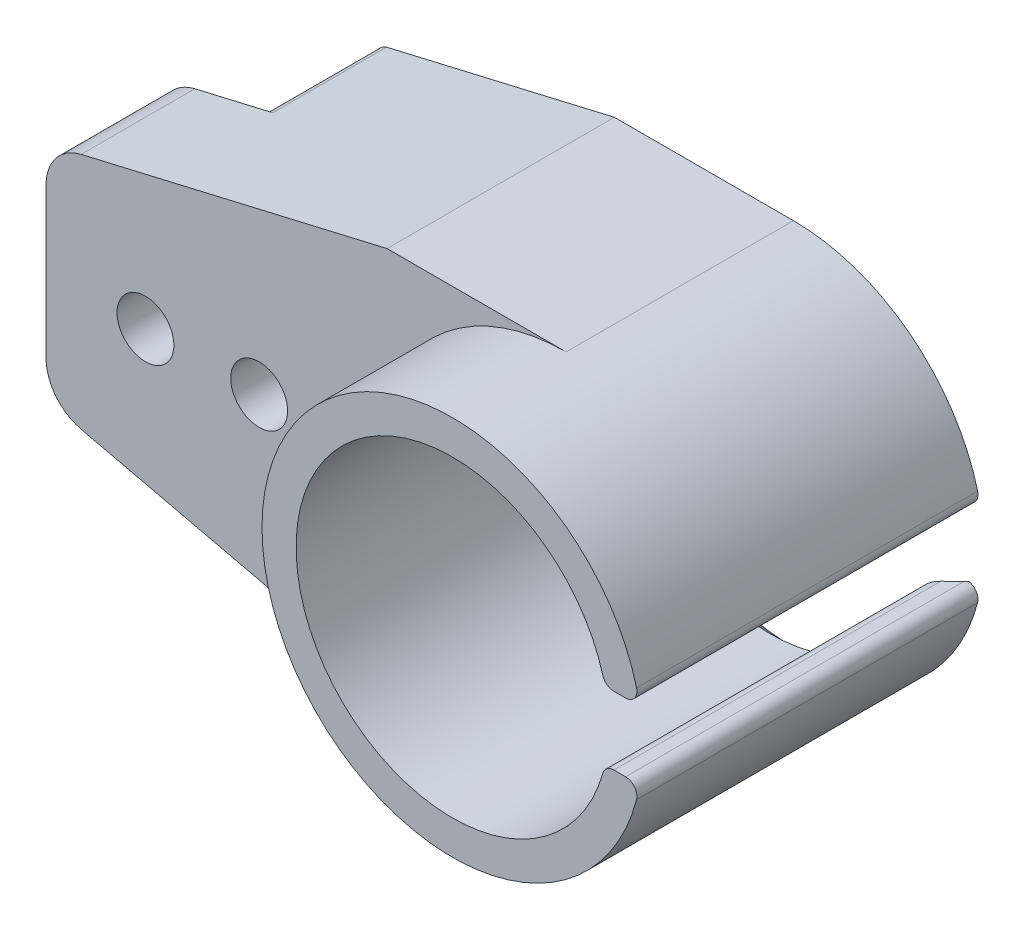
ISO-10303-21;
HEADER;
FILE_DESCRIPTION(('STEP AP214'),'2;1');
FILE_NAME('part.step','',(''),(''),'','','');
FILE_SCHEMA(('AUTOMOTIVE_DESIGN { 1 0 10303 214 1 1 1 1 }'));
ENDSEC;
DATA;
#1=APPLICATION_CONTEXT('core data for automotive mechanical design processes');
#2=APPLICATION_PROTOCOL_DEFINITION('international standard','automotive_design',2000,#1);
#3=PRODUCT_CONTEXT('',#1,'mechanical');
#4=PRODUCT('Part','Part','',(#3));
#5=PRODUCT_RELATED_PRODUCT_CATEGORY('part','',(#4));
#6=PRODUCT_DEFINITION_FORMATION('','',#4);
#7=PRODUCT_DEFINITION_CONTEXT('part definition',#1,'design');
#8=PRODUCT_DEFINITION('design','',#6,#7);
#9=PRODUCT_DEFINITION_SHAPE('','',#8);
#10=(LENGTH_UNIT() NAMED_UNIT(*) SI_UNIT(.MILLI.,.METRE.));
#11=(NAMED_UNIT(*) PLANE_ANGLE_UNIT() SI_UNIT($,.RADIAN.));
#12=(NAMED_UNIT(*) SI_UNIT($,.STERADIAN.) SOLID_ANGLE_UNIT());
#13=UNCERTAINTY_MEASURE_WITH_UNIT(LENGTH_MEASURE(1.E-05),#10,'distance_accuracy_value','');
#14=(GEOMETRIC_REPRESENTATION_CONTEXT(3) GLOBAL_UNCERTAINTY_ASSIGNED_CONTEXT((#13)) GLOBAL_UNIT_ASSIGNED_CONTEXT((#10,
#11,#12)) REPRESENTATION_CONTEXT('',''));
#15=CARTESIAN_POINT('',(0.,0.,0.));
#16=DIRECTION('',(0.,0.,1.));
#17=DIRECTION('',(1.,0.,0.));
#18=AXIS2_PLACEMENT_3D('',#15,#16,#17);
#19=CARTESIAN_POINT('',(-37.,0.,30.));
#20=DIRECTION('',(0.,0.,-1.));
#21=DIRECTION('',(-1.,0.,0.));
#22=AXIS2_PLACEMENT_3D('',#19,#20,#21);
#23=CYLINDRICAL_SURFACE('',#22,2.5);
#24=CARTESIAN_POINT('',(-37.,0.,10.));
#25=DIRECTION('',(0.,0.,-1.));
#26=DIRECTION('',(-1.,0.,0.));
#27=AXIS2_PLACEMENT_3D('',#24,#25,#26);
#28=CIRCLE('',#27,2.5);
#29=CARTESIAN_POINT('',(-39.5,0.,10.));
#30=VERTEX_POINT('',#29);
#31=EDGE_CURVE('E228',#30,#30,#28,.T.);
#32=ORIENTED_EDGE('',*,*,#31,.T.);
#33=EDGE_LOOP('',(#32));
#34=FACE_BOUND('',#33,.T.);
#35=CARTESIAN_POINT('',(-37.,0.,20.));
#36=DIRECTION('',(0.,0.,1.));
#37=DIRECTION('',(1.,0.,0.));
#38=AXIS2_PLACEMENT_3D('',#35,#36,#37);
#39=CIRCLE('',#38,2.5);
#40=CARTESIAN_POINT('',(-34.5,0.,20.));
#41=VERTEX_POINT('',#40);
#42=EDGE_CURVE('E496',#41,#41,#39,.T.);
#43=ORIENTED_EDGE('',*,*,#42,.T.);
#44=EDGE_LOOP('',(#43));
#45=FACE_BOUND('',#44,.T.);
#46=ADVANCED_FACE('F39',(#34,#45),#23,.F.);
#47=CARTESIAN_POINT('',(-27.,0.,30.));
#48=DIRECTION('',(0.,0.,-1.));
#49=DIRECTION('',(-1.,0.,0.));
#50=AXIS2_PLACEMENT_3D('',#47,#48,#49);
#51=CYLINDRICAL_SURFACE('',#50,2.5);
#52=CARTESIAN_POINT('',(-27.,0.,10.));
#53=DIRECTION('',(0.,0.,-1.));
#54=DIRECTION('',(-1.,0.,0.));
#55=AXIS2_PLACEMENT_3D('',#52,#53,#54);
#56=CIRCLE('',#55,2.5);
#57=CARTESIAN_POINT('',(-29.5,0.,10.));
#58=VERTEX_POINT('',#57);
#59=EDGE_CURVE('E382',#58,#58,#56,.T.);
#60=ORIENTED_EDGE('',*,*,#59,.T.);
#61=EDGE_LOOP('',(#60));
#62=FACE_BOUND('',#61,.T.);
#63=CARTESIAN_POINT('',(-27.,0.,20.));
#64=DIRECTION('',(0.,0.,1.));
#65=DIRECTION('',(1.,0.,0.));
#66=AXIS2_PLACEMENT_3D('',#63,#64,#65);
#67=CIRCLE('',#66,2.5);
#68=CARTESIAN_POINT('',(-24.5,0.,20.));
#69=VERTEX_POINT('',#68);
#70=EDGE_CURVE('E493',#69,#69,#67,.T.);
#71=ORIENTED_EDGE('',*,*,#70,.T.);
#72=EDGE_LOOP('',(#71));
#73=FACE_BOUND('',#72,.T.);
#74=ADVANCED_FACE('F276',(#62,#73),#51,.F.);
#75=CARTESIAN_POINT('',(-45.75,16.75,30.));
#76=DIRECTION('',(0.,-1.,0.));
#77=DIRECTION('',(0.,0.,-1.));
#78=AXIS2_PLACEMENT_3D('',#75,#76,#77);
#79=PLANE('',#78);
#80=DIRECTION('',(-1.,0.,0.));
#81=VECTOR('',#80,1.);
#82=CARTESIAN_POINT('',(-45.75,16.75,0.));
#83=LINE('',#82,#81);
#84=CARTESIAN_POINT('',(0.,16.75,0.));
#85=VERTEX_POINT('',#84);
#86=CARTESIAN_POINT('',(-15.75,16.75,0.));
#87=VERTEX_POINT('',#86);
#88=EDGE_CURVE('E201',#85,#87,#83,.T.);
#89=ORIENTED_EDGE('',*,*,#88,.T.);
#90=DIRECTION('',(0.,0.,1.));
#91=VECTOR('',#90,1.);
#92=CARTESIAN_POINT('',(-15.75,16.75,0.));
#93=LINE('',#92,#91);
#94=CARTESIAN_POINT('',(-15.75,16.75,20.));
#95=VERTEX_POINT('',#94);
#96=EDGE_CURVE('E206',#87,#95,#93,.T.);
#97=ORIENTED_EDGE('',*,*,#96,.T.);
#98=DIRECTION('',(-1.,0.,0.));
#99=VECTOR('',#98,1.);
#100=CARTESIAN_POINT('',(0.,16.75,20.));
#101=LINE('',#100,#99);
#102=CARTESIAN_POINT('',(0.,16.75,20.));
#103=VERTEX_POINT('',#102);
#104=EDGE_CURVE('E481',#103,#95,#101,.T.);
#105=ORIENTED_EDGE('',*,*,#104,.F.);
#106=DIRECTION('',(0.,0.,-1.));
#107=VECTOR('',#106,1.);
#108=CARTESIAN_POINT('',(0.,16.75,30.));
#109=LINE('',#108,#107);
#110=EDGE_CURVE('E221',#103,#85,#109,.T.);
#111=ORIENTED_EDGE('',*,*,#110,.T.);
#112=EDGE_LOOP('',(#89,#97,#105,#111));
#113=FACE_BOUND('',#112,.T.);
#114=ADVANCED_FACE('F219',(#113),#79,.F.);
#115=CARTESIAN_POINT('',(-45.75,-16.75,30.));
#116=DIRECTION('',(1.,0.,0.));
#117=DIRECTION('',(0.,0.,-1.));
#118=AXIS2_PLACEMENT_3D('',#115,#116,#117);
#119=PLANE('',#118);
#120=DIRECTION('',(0.,-1.,0.));
#121=VECTOR('',#120,1.);
#122=CARTESIAN_POINT('',(-45.75,16.75,20.));
#123=LINE('',#122,#121);
#124=CARTESIAN_POINT('',(-45.75,6.57588751980016,20.));
#125=VERTEX_POINT('',#124);
#126=CARTESIAN_POINT('',(-45.75,-6.57588751980016,20.));
#127=VERTEX_POINT('',#126);
#128=EDGE_CURVE('E484',#125,#127,#123,.T.);
#129=ORIENTED_EDGE('',*,*,#128,.F.);
#130=DIRECTION('',(0.,0.,1.));
#131=VECTOR('',#130,1.);
#132=CARTESIAN_POINT('',(-45.75,6.57588751980016,30.));
#133=LINE('',#132,#131);
#134=CARTESIAN_POINT('',(-45.75,6.57588751980016,10.));
#135=VERTEX_POINT('',#134);
#136=EDGE_CURVE('E60',#125,#135,#133,.F.);
#137=ORIENTED_EDGE('',*,*,#136,.T.);
#138=DIRECTION('',(0.,1.,0.));
#139=VECTOR('',#138,1.);
#140=CARTESIAN_POINT('',(-45.75,-10.1,10.));
#141=LINE('',#140,#139);
#142=CARTESIAN_POINT('',(-45.75,-6.57588751980017,10.));
#143=VERTEX_POINT('',#142);
#144=EDGE_CURVE('E500',#143,#135,#141,.T.);
#145=ORIENTED_EDGE('',*,*,#144,.F.);
#146=DIRECTION('',(0.,0.,1.));
#147=VECTOR('',#146,1.);
#148=CARTESIAN_POINT('',(-45.75,-6.57588751980017,30.));
#149=LINE('',#148,#147);
#150=EDGE_CURVE('E355',#143,#127,#149,.T.);
#151=ORIENTED_EDGE('',*,*,#150,.T.);
#152=EDGE_LOOP('',(#129,#137,#145,#151));
#153=FACE_BOUND('',#152,.T.);
#154=ADVANCED_FACE('F559',(#153),#119,.F.);
#155=CARTESIAN_POINT('',(0.,-16.75,30.));
#156=DIRECTION('',(0.,1.,0.));
#157=DIRECTION('',(0.,0.,1.));
#158=AXIS2_PLACEMENT_3D('',#155,#156,#157);
#159=PLANE('',#158);
#160=DIRECTION('',(1.,0.,0.));
#161=VECTOR('',#160,1.);
#162=CARTESIAN_POINT('',(-45.75,-16.75,20.));
#163=LINE('',#162,#161);
#164=CARTESIAN_POINT('',(-15.75,-16.75,20.));
#165=VERTEX_POINT('',#164);
#166=CARTESIAN_POINT('',(0.,-16.75,20.));
#167=VERTEX_POINT('',#166);
#168=EDGE_CURVE('E491',#165,#167,#163,.T.);
#169=ORIENTED_EDGE('',*,*,#168,.F.);
#170=DIRECTION('',(0.,0.,1.));
#171=VECTOR('',#170,1.);
#172=CARTESIAN_POINT('',(-15.75,-16.75,0.));
#173=LINE('',#172,#171);
#174=CARTESIAN_POINT('',(-15.75,-16.75,0.));
#175=VERTEX_POINT('',#174);
#176=EDGE_CURVE('E477',#175,#165,#173,.T.);
#177=ORIENTED_EDGE('',*,*,#176,.F.);
#178=DIRECTION('',(1.,0.,0.));
#179=VECTOR('',#178,1.);
#180=CARTESIAN_POINT('',(0.,-16.75,0.));
#181=LINE('',#180,#179);
#182=CARTESIAN_POINT('',(0.,-16.75,0.));
#183=VERTEX_POINT('',#182);
#184=EDGE_CURVE('E223',#175,#183,#181,.T.);
#185=ORIENTED_EDGE('',*,*,#184,.T.);
#186=DIRECTION('',(0.,0.,-1.));
#187=VECTOR('',#186,1.);
#188=CARTESIAN_POINT('',(0.,-16.75,30.));
#189=LINE('',#188,#187);
#190=EDGE_CURVE('E235',#167,#183,#189,.T.);
#191=ORIENTED_EDGE('',*,*,#190,.F.);
#192=EDGE_LOOP('',(#169,#177,#185,#191));
#193=FACE_BOUND('',#192,.T.);
#194=ADVANCED_FACE('F289',(#193),#159,.F.);
#195=CARTESIAN_POINT('',(0.,0.,30.));
#196=DIRECTION('',(0.,0.,1.));
#197=DIRECTION('',(1.,0.,0.));
#198=AXIS2_PLACEMENT_3D('',#195,#196,#197);
#199=PLANE('',#198);
#200=CARTESIAN_POINT('',(15.2335977365821,4.,30.));
#201=DIRECTION('',(0.,0.,1.));
#202=DIRECTION('',(1.,0.,0.));
#203=AXIS2_PLACEMENT_3D('',#200,#201,#202);
#204=CIRCLE('',#203,1.);
#205=CARTESIAN_POINT('',(15.2335977365821,3.,30.));
#206=VERTEX_POINT('',#205);
#207=CARTESIAN_POINT('',(16.2008102912858,4.25396825396825,30.));
#208=VERTEX_POINT('',#207);
#209=EDGE_CURVE('E400',#206,#208,#204,.T.);
#210=ORIENTED_EDGE('',*,*,#209,.T.);
#211=CARTESIAN_POINT('',(0.,0.,30.));
#212=DIRECTION('',(0.,0.,1.));
#213=DIRECTION('',(-1.,0.,0.));
#214=AXIS2_PLACEMENT_3D('',#211,#212,#213);
#215=CIRCLE('',#214,16.75);
#216=CARTESIAN_POINT('',(16.2008102912858,-4.25396825396825,30.));
#217=VERTEX_POINT('',#216);
#218=EDGE_CURVE('E441',#208,#217,#215,.T.);
#219=ORIENTED_EDGE('',*,*,#218,.T.);
#220=CARTESIAN_POINT('',(15.2335977365821,-4.,30.));
#221=DIRECTION('',(0.,0.,1.));
#222=DIRECTION('',(1.,0.,0.));
#223=AXIS2_PLACEMENT_3D('',#220,#221,#222);
#224=CIRCLE('',#223,1.);
#225=CARTESIAN_POINT('',(15.2335977365821,-3.,30.));
#226=VERTEX_POINT('',#225);
#227=EDGE_CURVE('E398',#217,#226,#224,.T.);
#228=ORIENTED_EDGE('',*,*,#227,.T.);
#229=DIRECTION('',(-1.,0.,0.));
#230=VECTOR('',#229,1.);
#231=CARTESIAN_POINT('',(16.479153497677,-3.,30.));
#232=LINE('',#231,#230);
#233=CARTESIAN_POINT('',(14.1972708645007,-3.,30.));
#234=VERTEX_POINT('',#233);
#235=EDGE_CURVE('E238',#226,#234,#232,.T.);
#236=ORIENTED_EDGE('',*,*,#235,.T.);
#237=CARTESIAN_POINT('',(14.1972708645007,-4.,30.));
#238=DIRECTION('',(0.,0.,1.));
#239=DIRECTION('',(1.,0.,0.));
#240=AXIS2_PLACEMENT_3D('',#237,#238,#239);
#241=CIRCLE('',#240,1.);
#242=CARTESIAN_POINT('',(13.2347440262295,-3.72881355932203,30.));
#243=VERTEX_POINT('',#242);
#244=EDGE_CURVE('E403',#234,#243,#241,.T.);
#245=ORIENTED_EDGE('',*,*,#244,.T.);
#246=CARTESIAN_POINT('',(0.,0.,30.));
#247=DIRECTION('',(0.,0.,-1.));
#248=DIRECTION('',(1.,0.,0.));
#249=AXIS2_PLACEMENT_3D('',#246,#247,#248);
#250=CIRCLE('',#249,13.75);
#251=CARTESIAN_POINT('',(13.2347440262295,3.72881355932203,30.));
#252=VERTEX_POINT('',#251);
#253=EDGE_CURVE('E234',#243,#252,#250,.T.);
#254=ORIENTED_EDGE('',*,*,#253,.T.);
#255=CARTESIAN_POINT('',(14.1972708645007,4.,30.));
#256=DIRECTION('',(0.,0.,1.));
#257=DIRECTION('',(1.,0.,0.));
#258=AXIS2_PLACEMENT_3D('',#255,#256,#257);
#259=CIRCLE('',#258,1.);
#260=CARTESIAN_POINT('',(14.1972708645007,3.,30.));
#261=VERTEX_POINT('',#260);
#262=EDGE_CURVE('E405',#252,#261,#259,.T.);
#263=ORIENTED_EDGE('',*,*,#262,.T.);
#264=DIRECTION('',(1.,0.,0.));
#265=VECTOR('',#264,1.);
#266=CARTESIAN_POINT('',(13.4187369003196,3.,30.));
#267=LINE('',#266,#265);
#268=EDGE_CURVE('E444',#261,#206,#267,.T.);
#269=ORIENTED_EDGE('',*,*,#268,.T.);
#270=EDGE_LOOP('',(#210,#219,#228,#236,#245,#254,#263,#269));
#271=FACE_BOUND('',#270,.T.);
#272=ADVANCED_FACE('F272',(#271),#199,.T.);
#273=CARTESIAN_POINT('',(0.,0.,0.));
#274=DIRECTION('',(0.,0.,1.));
#275=DIRECTION('',(1.,0.,0.));
#276=AXIS2_PLACEMENT_3D('',#273,#274,#275);
#277=PLANE('',#276);
#278=DIRECTION('',(1.,0.,0.));
#279=VECTOR('',#278,1.);
#280=CARTESIAN_POINT('',(-45.75,10.1,0.));
#281=LINE('',#280,#279);
#282=CARTESIAN_POINT('',(-35.5634509140716,10.1,0.));
#283=VERTEX_POINT('',#282);
#284=CARTESIAN_POINT('',(-27.,10.1,0.));
#285=VERTEX_POINT('',#284);
#286=EDGE_CURVE('E499',#283,#285,#281,.T.);
#287=ORIENTED_EDGE('',*,*,#286,.F.);
#288=CARTESIAN_POINT('',(-35.5634509140716,11.1,0.));
#289=DIRECTION('',(0.,0.,1.));
#290=DIRECTION('',(1.,0.,0.));
#291=AXIS2_PLACEMENT_3D('',#288,#289,#290);
#292=CIRCLE('',#291,1.);
#293=CARTESIAN_POINT('',(-35.790680529678,12.0738412097418,0.));
#294=VERTEX_POINT('',#293);
#295=EDGE_CURVE('E202',#283,#294,#292,.F.);
#296=ORIENTED_EDGE('',*,*,#295,.T.);
#297=DIRECTION('',(0.973841209741793,0.227229615606419,0.));
#298=VECTOR('',#297,1.);
#299=CARTESIAN_POINT('',(-15.75,16.75,0.));
#300=LINE('',#299,#298);
#301=EDGE_CURVE('E195',#294,#87,#300,.T.);
#302=ORIENTED_EDGE('',*,*,#301,.T.);
#303=ORIENTED_EDGE('',*,*,#88,.F.);
#304=CARTESIAN_POINT('',(0.,0.,0.));
#305=DIRECTION('',(0.,0.,1.));
#306=DIRECTION('',(1.,0.,0.));
#307=AXIS2_PLACEMENT_3D('',#304,#305,#306);
#308=CIRCLE('',#307,16.75);
#309=CARTESIAN_POINT('',(16.2008102912858,4.25396825396825,0.));
#310=VERTEX_POINT('',#309);
#311=EDGE_CURVE('E224',#310,#85,#308,.T.);
#312=ORIENTED_EDGE('',*,*,#311,.F.);
#313=CARTESIAN_POINT('',(15.2335977365821,4.,0.));
#314=DIRECTION('',(0.,0.,1.));
#315=DIRECTION('',(1.,0.,0.));
#316=AXIS2_PLACEMENT_3D('',#313,#314,#315);
#317=CIRCLE('',#316,1.);
#318=CARTESIAN_POINT('',(15.4567328218829,3.02521246740236,0.));
#319=VERTEX_POINT('',#318);
#320=EDGE_CURVE('E411',#310,#319,#317,.F.);
#321=ORIENTED_EDGE('',*,*,#320,.T.);
#322=CARTESIAN_POINT('',(0.,0.,0.));
#323=DIRECTION('',(0.,0.,1.));
#324=DIRECTION('',(1.,0.,0.));
#325=AXIS2_PLACEMENT_3D('',#322,#323,#324);
#326=CIRCLE('',#325,15.75);
#327=CARTESIAN_POINT('',(15.4567328218829,-3.02521246740236,0.));
#328=VERTEX_POINT('',#327);
#329=EDGE_CURVE('E252',#319,#328,#326,.T.);
#330=ORIENTED_EDGE('',*,*,#329,.T.);
#331=CARTESIAN_POINT('',(15.2335977365821,-4.,0.));
#332=DIRECTION('',(0.,0.,1.));
#333=DIRECTION('',(1.,0.,0.));
#334=AXIS2_PLACEMENT_3D('',#331,#332,#333);
#335=CIRCLE('',#334,1.);
#336=CARTESIAN_POINT('',(16.2008102912858,-4.25396825396825,0.));
#337=VERTEX_POINT('',#336);
#338=EDGE_CURVE('E409',#328,#337,#335,.F.);
#339=ORIENTED_EDGE('',*,*,#338,.T.);
#340=CARTESIAN_POINT('',(0.,0.,0.));
#341=DIRECTION('',(0.,0.,1.));
#342=DIRECTION('',(-1.,0.,0.));
#343=AXIS2_PLACEMENT_3D('',#340,#341,#342);
#344=CIRCLE('',#343,16.75);
#345=EDGE_CURVE('E226',#183,#337,#344,.T.);
#346=ORIENTED_EDGE('',*,*,#345,.F.);
#347=ORIENTED_EDGE('',*,*,#184,.F.);
#348=DIRECTION('',(-0.973841209741793,0.227229615606419,0.));
#349=VECTOR('',#348,1.);
#350=CARTESIAN_POINT('',(-15.75,-16.75,0.));
#351=LINE('',#350,#349);
#352=CARTESIAN_POINT('',(-35.790680529678,-12.0738412097418,0.));
#353=VERTEX_POINT('',#352);
#354=EDGE_CURVE('E471',#175,#353,#351,.T.);
#355=ORIENTED_EDGE('',*,*,#354,.T.);
#356=CARTESIAN_POINT('',(-35.5634509140716,-11.1,0.));
#357=DIRECTION('',(0.,0.,1.));
#358=DIRECTION('',(1.,0.,0.));
#359=AXIS2_PLACEMENT_3D('',#356,#357,#358);
#360=CIRCLE('',#359,1.);
#361=CARTESIAN_POINT('',(-35.5634509140716,-10.1,0.));
#362=VERTEX_POINT('',#361);
#363=EDGE_CURVE('E376',#353,#362,#360,.F.);
#364=ORIENTED_EDGE('',*,*,#363,.T.);
#365=DIRECTION('',(-1.,0.,0.));
#366=VECTOR('',#365,1.);
#367=CARTESIAN_POINT('',(-27.,-10.1,0.));
#368=LINE('',#367,#366);
#369=CARTESIAN_POINT('',(-27.,-10.1,0.));
#370=VERTEX_POINT('',#369);
#371=EDGE_CURVE('E503',#370,#362,#368,.T.);
#372=ORIENTED_EDGE('',*,*,#371,.F.);
#373=CARTESIAN_POINT('',(-27.,0.,0.));
#374=DIRECTION('',(0.,0.,-1.));
#375=DIRECTION('',(-1.,0.,0.));
#376=AXIS2_PLACEMENT_3D('',#373,#374,#375);
#377=CIRCLE('',#376,10.1);
#378=EDGE_CURVE('E513',#285,#370,#377,.T.);
#379=ORIENTED_EDGE('',*,*,#378,.F.);
#380=EDGE_LOOP('',(#287,#296,#302,#303,#312,#321,#330,#339,#346,#347,#355,#364,#372,#379));
#381=FACE_BOUND('',#380,.T.);
#382=ADVANCED_FACE('F198',(#381),#277,.F.);
#383=CARTESIAN_POINT('',(0.,0.,30.));
#384=DIRECTION('',(0.,0.,-1.));
#385=DIRECTION('',(-1.,0.,0.));
#386=AXIS2_PLACEMENT_3D('',#383,#384,#385);
#387=CYLINDRICAL_SURFACE('',#386,13.75);
#388=ORIENTED_EDGE('',*,*,#253,.F.);
#389=DIRECTION('',(0.,0.,-1.));
#390=VECTOR('',#389,1.);
#391=CARTESIAN_POINT('',(13.2347440262294,-3.72881355932203,30.));
#392=LINE('',#391,#390);
#393=CARTESIAN_POINT('',(13.2347440262295,-3.72881355932203,2.));
#394=VERTEX_POINT('',#393);
#395=EDGE_CURVE('E381',#243,#394,#392,.T.);
#396=ORIENTED_EDGE('',*,*,#395,.T.);
#397=CARTESIAN_POINT('',(0.,0.,2.));
#398=DIRECTION('',(0.,0.,1.));
#399=DIRECTION('',(1.,0.,0.));
#400=AXIS2_PLACEMENT_3D('',#397,#398,#399);
#401=CIRCLE('',#400,13.75);
#402=CARTESIAN_POINT('',(13.2347440262295,3.72881355932203,2.));
#403=VERTEX_POINT('',#402);
#404=EDGE_CURVE('E240',#394,#403,#401,.F.);
#405=ORIENTED_EDGE('',*,*,#404,.T.);
#406=DIRECTION('',(0.,0.,-1.));
#407=VECTOR('',#406,1.);
#408=CARTESIAN_POINT('',(13.2347440262294,3.72881355932203,30.));
#409=LINE('',#408,#407);
#410=EDGE_CURVE('E388',#403,#252,#409,.F.);
#411=ORIENTED_EDGE('',*,*,#410,.T.);
#412=EDGE_LOOP('',(#388,#396,#405,#411));
#413=FACE_BOUND('',#412,.T.);
#414=ADVANCED_FACE('F264',(#413),#387,.F.);
#415=CARTESIAN_POINT('',(13.4187369003196,3.,30.));
#416=DIRECTION('',(0.,1.,0.));
#417=DIRECTION('',(0.,0.,1.));
#418=AXIS2_PLACEMENT_3D('',#415,#416,#417);
#419=PLANE('',#418);
#420=CARTESIAN_POINT('',(13.4187369003196,3.,2.));
#421=CARTESIAN_POINT('',(13.5892420785567,3.,1.83360189063175));
#422=CARTESIAN_POINT('',(13.7596725050172,3.,1.6671272100676));
#423=CARTESIAN_POINT('',(14.1003977059202,3.,1.334039267167));
#424=CARTESIAN_POINT('',(14.2706924804361,3.,1.1674260049056));
#425=CARTESIAN_POINT('',(14.6111603962887,3.,0.834075295950689));
#426=CARTESIAN_POINT('',(14.7813335376378,3.,0.667337849269743));
#427=CARTESIAN_POINT('',(15.1215696396513,3.,0.333750392598995));
#428=CARTESIAN_POINT('',(15.2916326002562,3.,0.166900382548354));
#429=CARTESIAN_POINT('',(15.4616460960662,3.,0.));
#430=B_SPLINE_CURVE_WITH_KNOTS('',3,(#420,#421,#422,#423,#424,#425,#426,#427,#428,#429),
.UNSPECIFIED.,.F.,.F.,(4,2,2,2,4),(0.,0.714732851002708,1.42946531515944,2.14419770694695,
2.85893048534193),.UNSPECIFIED.);
#431=CARTESIAN_POINT('',(14.1972708645007,3.,1.23922813906855));
#432=VERTEX_POINT('',#431);
#433=CARTESIAN_POINT('',(15.2335977365821,3.,0.223812444775767));
#434=VERTEX_POINT('',#433);
#435=EDGE_CURVE('E243',#432,#434,#430,.T.);
#436=ORIENTED_EDGE('',*,*,#435,.T.);
#437=DIRECTION('',(0.,0.,-1.));
#438=VECTOR('',#437,1.);
#439=CARTESIAN_POINT('',(15.2335977365821,3.,30.));
#440=LINE('',#439,#438);
#441=EDGE_CURVE('E390',#434,#206,#440,.F.);
#442=ORIENTED_EDGE('',*,*,#441,.T.);
#443=ORIENTED_EDGE('',*,*,#268,.F.);
#444=DIRECTION('',(0.,0.,-1.));
#445=VECTOR('',#444,1.);
#446=CARTESIAN_POINT('',(14.1972708645007,3.,30.));
#447=LINE('',#446,#445);
#448=EDGE_CURVE('E392',#261,#432,#447,.T.);
#449=ORIENTED_EDGE('',*,*,#448,.T.);
#450=EDGE_LOOP('',(#436,#442,#443,#449));
#451=FACE_BOUND('',#450,.T.);
#452=ADVANCED_FACE('F259',(#451),#419,.F.);
#453=CARTESIAN_POINT('',(0.,0.,30.));
#454=DIRECTION('',(0.,0.,-1.));
#455=DIRECTION('',(-1.,0.,0.));
#456=AXIS2_PLACEMENT_3D('',#453,#454,#455);
#457=CYLINDRICAL_SURFACE('',#456,16.75);
#458=ORIENTED_EDGE('',*,*,#345,.T.);
#459=DIRECTION('',(0.,0.,-1.));
#460=VECTOR('',#459,1.);
#461=CARTESIAN_POINT('',(16.2008102912858,-4.25396825396825,30.));
#462=LINE('',#461,#460);
#463=EDGE_CURVE('E407',#337,#217,#462,.F.);
#464=ORIENTED_EDGE('',*,*,#463,.T.);
#465=ORIENTED_EDGE('',*,*,#218,.F.);
#466=DIRECTION('',(0.,0.,-1.));
#467=VECTOR('',#466,1.);
#468=CARTESIAN_POINT('',(16.2008102912858,4.25396825396825,30.));
#469=LINE('',#468,#467);
#470=EDGE_CURVE('E395',#208,#310,#469,.T.);
#471=ORIENTED_EDGE('',*,*,#470,.T.);
#472=ORIENTED_EDGE('',*,*,#311,.T.);
#473=ORIENTED_EDGE('',*,*,#110,.F.);
#474=CARTESIAN_POINT('',(0.,0.,20.));
#475=DIRECTION('',(0.,0.,-1.));
#476=DIRECTION('',(1.,0.,0.));
#477=AXIS2_PLACEMENT_3D('',#474,#475,#476);
#478=CIRCLE('',#477,16.75);
#479=EDGE_CURVE('E479',#167,#103,#478,.T.);
#480=ORIENTED_EDGE('',*,*,#479,.F.);
#481=ORIENTED_EDGE('',*,*,#190,.T.);
#482=EDGE_LOOP('',(#458,#464,#465,#471,#472,#473,#480,#481));
#483=FACE_BOUND('',#482,.T.);
#484=ADVANCED_FACE('F263',(#483),#457,.T.);
#485=CARTESIAN_POINT('',(16.479153497677,-3.,30.));
#486=DIRECTION('',(0.,-1.,0.));
#487=DIRECTION('',(0.,0.,-1.));
#488=AXIS2_PLACEMENT_3D('',#485,#486,#487);
#489=PLANE('',#488);
#490=ORIENTED_EDGE('',*,*,#235,.F.);
#491=DIRECTION('',(0.,0.,-1.));
#492=VECTOR('',#491,1.);
#493=CARTESIAN_POINT('',(15.2335977365821,-3.,30.));
#494=LINE('',#493,#492);
#495=CARTESIAN_POINT('',(15.2335977365821,-3.,0.223812444775768));
#496=VERTEX_POINT('',#495);
#497=EDGE_CURVE('E307',#226,#496,#494,.T.);
#498=ORIENTED_EDGE('',*,*,#497,.T.);
#499=CARTESIAN_POINT('',(15.4616460960662,-3.,0.));
#500=CARTESIAN_POINT('',(15.2916326002562,-3.,0.166900382548354));
#501=CARTESIAN_POINT('',(15.1215696396513,-3.,0.333750392598996));
#502=CARTESIAN_POINT('',(14.7813335376378,-3.,0.667337849269746));
#503=CARTESIAN_POINT('',(14.6111603962887,-3.,0.834075295950691));
#504=CARTESIAN_POINT('',(14.2706924804361,-3.,1.16742600490561));
#505=CARTESIAN_POINT('',(14.1003977059202,-3.,1.334039267167));
#506=CARTESIAN_POINT('',(13.7596725050172,-3.,1.6671272100676));
#507=CARTESIAN_POINT('',(13.5892420785567,-3.,1.83360189063175));
#508=CARTESIAN_POINT('',(13.4187369003196,-3.,2.));
#509=B_SPLINE_CURVE_WITH_KNOTS('',3,(#499,#500,#501,#502,#503,#504,#505,#506,#507,#508),
.UNSPECIFIED.,.F.,.F.,(4,2,2,2,4),(0.,0.714732778394987,1.42946517018249,2.14419763433922,
2.85893048534193),.UNSPECIFIED.);
#510=CARTESIAN_POINT('',(14.1972708645007,-3.,1.23922813906855));
#511=VERTEX_POINT('',#510);
#512=EDGE_CURVE('E298',#496,#511,#509,.T.);
#513=ORIENTED_EDGE('',*,*,#512,.T.);
#514=DIRECTION('',(0.,0.,-1.));
#515=VECTOR('',#514,1.);
#516=CARTESIAN_POINT('',(14.1972708645007,-3.,30.));
#517=LINE('',#516,#515);
#518=EDGE_CURVE('E305',#511,#234,#517,.F.);
#519=ORIENTED_EDGE('',*,*,#518,.T.);
#520=EDGE_LOOP('',(#490,#498,#513,#519));
#521=FACE_BOUND('',#520,.T.);
#522=ADVANCED_FACE('F292',(#521),#489,.F.);
#523=CARTESIAN_POINT('',(0.,0.,2.));
#524=DIRECTION('',(0.,0.,-1.));
#525=DIRECTION('',(-1.,0.,0.));
#526=AXIS2_PLACEMENT_3D('',#523,#524,#525);
#527=CONICAL_SURFACE('',#526,13.75,0.785398163397449);
#528=ORIENTED_EDGE('',*,*,#512,.F.);
#529=CARTESIAN_POINT('',(15.2335977365821,-3.,0.223812444775768));
#530=CARTESIAN_POINT('',(15.2714308403681,-3.00003262905446,0.186682656412954));
#531=CARTESIAN_POINT('',(15.3089419827028,-3.00214998253191,0.149466725166834));
#532=CARTESIAN_POINT('',(15.3833203444698,-3.01055413833272,0.0748625769082441));
#533=CARTESIAN_POINT('',(15.4201875639019,-3.01684094065607,0.0374743598957759));
#534=CARTESIAN_POINT('',(15.4567328218829,-3.02521246740236,0.));
#535=B_SPLINE_CURVE_WITH_KNOTS('',3,(#529,#530,#531,#532,#533,#534),.UNSPECIFIED.,.F.,.F.,(4,2,
4),(0.,0.15864851310905,0.31729702621698),.UNSPECIFIED.);
#536=EDGE_CURVE('E413',#496,#328,#535,.T.);
#537=ORIENTED_EDGE('',*,*,#536,.T.);
#538=ORIENTED_EDGE('',*,*,#329,.F.);
#539=CARTESIAN_POINT('',(15.4567328218829,3.02521246740236,0.));
#540=CARTESIAN_POINT('',(15.4201875639019,3.01684094065607,0.0374743598957743));
#541=CARTESIAN_POINT('',(15.3833203444698,3.01055413833272,0.0748625769082433));
#542=CARTESIAN_POINT('',(15.3089419827028,3.00214998253191,0.149466725166834));
#543=CARTESIAN_POINT('',(15.2714308403681,3.00003262905446,0.186682656412954));
#544=CARTESIAN_POINT('',(15.2335977365821,3.,0.223812444775768));
#545=B_SPLINE_CURVE_WITH_KNOTS('',3,(#539,#540,#541,#542,#543,#544),.UNSPECIFIED.,.F.,.F.,(4,2,
4),(0.,0.158648513107931,0.317297026216981),.UNSPECIFIED.);
#546=EDGE_CURVE('E418',#319,#434,#545,.T.);
#547=ORIENTED_EDGE('',*,*,#546,.T.);
#548=ORIENTED_EDGE('',*,*,#435,.F.);
#549=CARTESIAN_POINT('',(14.1972708645007,3.,1.23922813906855));
#550=CARTESIAN_POINT('',(14.1672596244913,3.00000630187263,1.26858906481679));
#551=CARTESIAN_POINT('',(14.1371193148195,3.00135110223293,1.29779696419717));
#552=CARTESIAN_POINT('',(14.076639815093,3.00683624080135,1.35580777784303));
#553=CARTESIAN_POINT('',(14.046300438517,3.0109797420731,1.3846101961975));
#554=CARTESIAN_POINT('',(13.954630440369,3.02788262386854,1.47067262034055));
#555=CARTESIAN_POINT('',(13.8931903794703,3.04511894927495,1.52705555438692));
#556=CARTESIAN_POINT('',(13.7848407928433,3.08757966448139,1.62363522272017));
#557=CARTESIAN_POINT('',(13.7376819405989,3.11024547511269,1.66468206573317));
#558=CARTESIAN_POINT('',(13.645244392566,3.16446198380739,1.74267462192123));
#559=CARTESIAN_POINT('',(13.5999600205521,3.19598319971382,1.77963338586777));
#560=CARTESIAN_POINT('',(13.5233393112415,3.2599535364204,1.83932715979955));
#561=CARTESIAN_POINT('',(13.4912790794006,3.29033311969572,1.86334009690611));
#562=CARTESIAN_POINT('',(13.430143014345,3.35692205805531,1.90673078427126));
#563=CARTESIAN_POINT('',(13.4010644893441,3.39312607779589,1.92611273663906));
#564=CARTESIAN_POINT('',(13.352284499998,3.46382388011514,1.95578855321709));
#565=CARTESIAN_POINT('',(13.3318455205079,3.49737824762865,1.9671030586662));
#566=CARTESIAN_POINT('',(13.2947001818849,3.56764042032953,1.98498550029202));
#567=CARTESIAN_POINT('',(13.2779856471801,3.60434106868679,1.9915639050479));
#568=CARTESIAN_POINT('',(13.258066497655,3.65630246906703,1.99701328332333));
#569=CARTESIAN_POINT('',(13.2529444064734,3.67063653840069,1.99813191309445));
#570=CARTESIAN_POINT('',(13.2433516989838,3.69955114559926,1.99962501829846));
#571=CARTESIAN_POINT('',(13.2388807586923,3.71413155683743,1.99999986498457));
#572=CARTESIAN_POINT('',(13.2347440262294,3.72881355932203,2.));
#573=B_SPLINE_CURVE_WITH_KNOTS('',3,(#549,#550,#551,#552,#553,#554,#555,#556,#557,#558,#559,
#560,#561,#562,#563,#564,#565,#566,#567,#568,#569,#570,#571,#572),.UNSPECIFIED.,.F.,.F.,(4,2,2,
2,2,2,2,2,2,2,2,4),(0.,0.12589921535764,0.251940959359116,0.506285925644896,0.705215816837914,
0.903491106691471,1.05379632251983,1.20396463050045,1.32613779426145,1.4480400728847,
1.49380121120138,1.53953950246931),.UNSPECIFIED.);
#574=EDGE_CURVE('E310',#432,#403,#573,.T.);
#575=ORIENTED_EDGE('',*,*,#574,.T.);
#576=ORIENTED_EDGE('',*,*,#404,.F.);
#577=CARTESIAN_POINT('',(13.2347440262294,-3.72881355932203,2.));
#578=CARTESIAN_POINT('',(13.2407218478135,-3.70758422137118,2.00000375862321));
#579=CARTESIAN_POINT('',(13.2474050525263,-3.68656844436341,1.99921659631818));
#580=CARTESIAN_POINT('',(13.2620931631392,-3.64514198138205,1.99610246736422));
#581=CARTESIAN_POINT('',(13.2700968602509,-3.62473076196382,1.99377690317357));
#582=CARTESIAN_POINT('',(13.2957961877761,-3.56502520968158,1.98461661363988));
#583=CARTESIAN_POINT('',(13.3153066232022,-3.52681616397324,1.975596354715));
#584=CARTESIAN_POINT('',(13.3581043099884,-3.45450392719685,1.95250343736967));
#585=CARTESIAN_POINT('',(13.3813791167295,-3.42038783137422,1.93844724724138));
#586=CARTESIAN_POINT('',(13.4308315755221,-3.35640797244032,1.90618069665913));
#587=CARTESIAN_POINT('',(13.4570163026198,-3.32655499530481,1.88796009226796));
#588=CARTESIAN_POINT('',(13.523687340632,-3.2587477550591,1.83931317661131));
#589=CARTESIAN_POINT('',(13.5653032078565,-3.22320073161143,1.80708566741417));
#590=CARTESIAN_POINT('',(13.6510081406003,-3.16070112094753,1.73791824541441));
#591=CARTESIAN_POINT('',(13.695102879073,-3.13376927641642,1.70096725460817));
#592=CARTESIAN_POINT('',(13.8031441603516,-3.07818876110092,1.60786707451445));
#593=CARTESIAN_POINT('',(13.8677281854394,-3.05347431949433,1.55011917630008));
#594=CARTESIAN_POINT('',(13.9972444481731,-3.01791048370767,1.43114289153325));
#595=CARTESIAN_POINT('',(14.0621764736322,-3.00705343384205,1.36991644629339));
#596=CARTESIAN_POINT('',(14.1502484807268,-3.00082895368678,1.28506017278329));
#597=CARTESIAN_POINT('',(14.1738090131267,-3.00000619471995,1.26218051368378));
#598=CARTESIAN_POINT('',(14.1972708645007,-2.99999999999999,1.23922813906855));
#599=B_SPLINE_CURVE_WITH_KNOTS('',3,(#577,#578,#579,#580,#581,#582,#583,#584,#585,#586,#587,
#588,#589,#590,#591,#592,#593,#594,#595,#596,#597,#598),.UNSPECIFIED.,.F.,.F.,(4,2,2,2,2,2,2,2,
2,2,4),(0.,0.0661117193894121,0.132163252043153,0.26290712583797,0.393227291587911,
0.523871546216422,0.713358523418417,0.903298351456971,1.17214025242451,1.44083356401623,
1.53933593788775),.UNSPECIFIED.);
#600=EDGE_CURVE('E317',#394,#511,#599,.T.);
#601=ORIENTED_EDGE('',*,*,#600,.T.);
#602=EDGE_LOOP('',(#528,#537,#538,#547,#548,#575,#576,#601));
#603=FACE_BOUND('',#602,.T.);
#604=ADVANCED_FACE('F255',(#603),#527,.F.);
#605=CARTESIAN_POINT('',(15.2335977365821,-4.,30.));
#606=DIRECTION('',(0.,0.,-1.));
#607=DIRECTION('',(-1.,0.,0.));
#608=AXIS2_PLACEMENT_3D('',#605,#606,#607);
#609=CYLINDRICAL_SURFACE('',#608,1.);
#610=ORIENTED_EDGE('',*,*,#227,.F.);
#611=ORIENTED_EDGE('',*,*,#463,.F.);
#612=ORIENTED_EDGE('',*,*,#338,.F.);
#613=ORIENTED_EDGE('',*,*,#536,.F.);
#614=ORIENTED_EDGE('',*,*,#497,.F.);
#615=EDGE_LOOP('',(#610,#611,#612,#613,#614));
#616=FACE_BOUND('',#615,.T.);
#617=ADVANCED_FACE('F423',(#616),#609,.T.);
#618=CARTESIAN_POINT('',(15.2335977365821,4.,30.));
#619=DIRECTION('',(0.,0.,-1.));
#620=DIRECTION('',(-1.,0.,0.));
#621=AXIS2_PLACEMENT_3D('',#618,#619,#620);
#622=CYLINDRICAL_SURFACE('',#621,1.);
#623=ORIENTED_EDGE('',*,*,#209,.F.);
#624=ORIENTED_EDGE('',*,*,#441,.F.);
#625=ORIENTED_EDGE('',*,*,#546,.F.);
#626=ORIENTED_EDGE('',*,*,#320,.F.);
#627=ORIENTED_EDGE('',*,*,#470,.F.);
#628=EDGE_LOOP('',(#623,#624,#625,#626,#627));
#629=FACE_BOUND('',#628,.T.);
#630=ADVANCED_FACE('F426',(#629),#622,.T.);
#631=CARTESIAN_POINT('',(14.1972708645007,-4.,30.));
#632=DIRECTION('',(0.,0.,-1.));
#633=DIRECTION('',(-1.,0.,0.));
#634=AXIS2_PLACEMENT_3D('',#631,#632,#633);
#635=CYLINDRICAL_SURFACE('',#634,1.);
#636=ORIENTED_EDGE('',*,*,#244,.F.);
#637=ORIENTED_EDGE('',*,*,#518,.F.);
#638=ORIENTED_EDGE('',*,*,#600,.F.);
#639=ORIENTED_EDGE('',*,*,#395,.F.);
#640=EDGE_LOOP('',(#636,#637,#638,#639));
#641=FACE_BOUND('',#640,.T.);
#642=ADVANCED_FACE('F329',(#641),#635,.T.);
#643=CARTESIAN_POINT('',(14.1972708645007,4.,30.));
#644=DIRECTION('',(0.,0.,-1.));
#645=DIRECTION('',(-1.,0.,0.));
#646=AXIS2_PLACEMENT_3D('',#643,#644,#645);
#647=CYLINDRICAL_SURFACE('',#646,1.);
#648=ORIENTED_EDGE('',*,*,#262,.F.);
#649=ORIENTED_EDGE('',*,*,#410,.F.);
#650=ORIENTED_EDGE('',*,*,#574,.F.);
#651=ORIENTED_EDGE('',*,*,#448,.F.);
#652=EDGE_LOOP('',(#648,#649,#650,#651));
#653=FACE_BOUND('',#652,.T.);
#654=ADVANCED_FACE('F324',(#653),#647,.T.);
#655=CARTESIAN_POINT('',(-27.,-10.1,10.));
#656=DIRECTION('',(0.,-1.,0.));
#657=DIRECTION('',(0.,0.,-1.));
#658=AXIS2_PLACEMENT_3D('',#655,#656,#657);
#659=PLANE('',#658);
#660=ORIENTED_EDGE('',*,*,#371,.T.);
#661=DIRECTION('',(0.,0.,1.));
#662=VECTOR('',#661,1.);
#663=CARTESIAN_POINT('',(-35.5634509140716,-10.1,10.));
#664=LINE('',#663,#662);
#665=CARTESIAN_POINT('',(-35.5634509140716,-10.1,10.));
#666=VERTEX_POINT('',#665);
#667=EDGE_CURVE('E370',#362,#666,#664,.T.);
#668=ORIENTED_EDGE('',*,*,#667,.T.);
#669=DIRECTION('',(-1.,0.,0.));
#670=VECTOR('',#669,1.);
#671=CARTESIAN_POINT('',(-27.,-10.1,10.));
#672=LINE('',#671,#670);
#673=CARTESIAN_POINT('',(-27.,-10.1,10.));
#674=VERTEX_POINT('',#673);
#675=EDGE_CURVE('E508',#674,#666,#672,.T.);
#676=ORIENTED_EDGE('',*,*,#675,.F.);
#677=DIRECTION('',(0.,0.,-1.));
#678=VECTOR('',#677,1.);
#679=CARTESIAN_POINT('',(-27.,-10.1,10.));
#680=LINE('',#679,#678);
#681=EDGE_CURVE('E385',#674,#370,#680,.T.);
#682=ORIENTED_EDGE('',*,*,#681,.T.);
#683=EDGE_LOOP('',(#660,#668,#676,#682));
#684=FACE_BOUND('',#683,.T.);
#685=ADVANCED_FACE('F328',(#684),#659,.F.);
#686=CARTESIAN_POINT('',(-27.,0.,10.));
#687=DIRECTION('',(0.,0.,-1.));
#688=DIRECTION('',(-1.,0.,0.));
#689=AXIS2_PLACEMENT_3D('',#686,#687,#688);
#690=CYLINDRICAL_SURFACE('',#689,10.1);
#691=ORIENTED_EDGE('',*,*,#378,.T.);
#692=ORIENTED_EDGE('',*,*,#681,.F.);
#693=CARTESIAN_POINT('',(-27.,0.,10.));
#694=DIRECTION('',(0.,0.,-1.));
#695=DIRECTION('',(-1.,0.,0.));
#696=AXIS2_PLACEMENT_3D('',#693,#694,#695);
#697=CIRCLE('',#696,10.1);
#698=CARTESIAN_POINT('',(-27.,10.1,10.));
#699=VERTEX_POINT('',#698);
#700=EDGE_CURVE('E505',#699,#674,#697,.T.);
#701=ORIENTED_EDGE('',*,*,#700,.F.);
#702=DIRECTION('',(0.,0.,-1.));
#703=VECTOR('',#702,1.);
#704=CARTESIAN_POINT('',(-27.,10.1,10.));
#705=LINE('',#704,#703);
#706=EDGE_CURVE('E511',#699,#285,#705,.T.);
#707=ORIENTED_EDGE('',*,*,#706,.T.);
#708=EDGE_LOOP('',(#691,#692,#701,#707));
#709=FACE_BOUND('',#708,.T.);
#710=ADVANCED_FACE('F544',(#709),#690,.F.);
#711=CARTESIAN_POINT('',(-45.75,10.1,10.));
#712=DIRECTION('',(0.,1.,0.));
#713=DIRECTION('',(-1.,0.,0.));
#714=AXIS2_PLACEMENT_3D('',#711,#712,#713);
#715=PLANE('',#714);
#716=DIRECTION('',(1.,0.,0.));
#717=VECTOR('',#716,1.);
#718=CARTESIAN_POINT('',(-45.75,10.1,10.));
#719=LINE('',#718,#717);
#720=CARTESIAN_POINT('',(-35.5634509140716,10.1,10.));
#721=VERTEX_POINT('',#720);
#722=EDGE_CURVE('E502',#721,#699,#719,.T.);
#723=ORIENTED_EDGE('',*,*,#722,.F.);
#724=DIRECTION('',(0.,0.,-1.));
#725=VECTOR('',#724,1.);
#726=CARTESIAN_POINT('',(-35.5634509140716,10.1,10.));
#727=LINE('',#726,#725);
#728=EDGE_CURVE('E378',#721,#283,#727,.T.);
#729=ORIENTED_EDGE('',*,*,#728,.T.);
#730=ORIENTED_EDGE('',*,*,#286,.T.);
#731=ORIENTED_EDGE('',*,*,#706,.F.);
#732=EDGE_LOOP('',(#723,#729,#730,#731));
#733=FACE_BOUND('',#732,.T.);
#734=ADVANCED_FACE('F526',(#733),#715,.F.);
#735=CARTESIAN_POINT('',(-27.,0.,10.));
#736=DIRECTION('',(0.,0.,-1.));
#737=DIRECTION('',(-1.,0.,0.));
#738=AXIS2_PLACEMENT_3D('',#735,#736,#737);
#739=PLANE('',#738);
#740=ORIENTED_EDGE('',*,*,#144,.T.);
#741=CARTESIAN_POINT('',(-41.75,6.57588751980016,10.));
#742=DIRECTION('',(0.,0.,-1.));
#743=DIRECTION('',(-1.,0.,0.));
#744=AXIS2_PLACEMENT_3D('',#741,#742,#743);
#745=CIRCLE('',#744,4.);
#746=CARTESIAN_POINT('',(-42.6589184624257,10.4712523587673,10.));
#747=VERTEX_POINT('',#746);
#748=EDGE_CURVE('E47',#135,#747,#745,.T.);
#749=ORIENTED_EDGE('',*,*,#748,.T.);
#750=DIRECTION('',(-0.973841209741793,-0.227229615606419,0.));
#751=VECTOR('',#750,1.);
#752=CARTESIAN_POINT('',(-30.1256585879874,13.3956796628029,10.));
#753=LINE('',#752,#751);
#754=CARTESIAN_POINT('',(-35.790680529678,12.0738412097418,10.));
#755=VERTEX_POINT('',#754);
#756=EDGE_CURVE('E482',#755,#747,#753,.T.);
#757=ORIENTED_EDGE('',*,*,#756,.F.);
#758=CARTESIAN_POINT('',(-35.5634509140716,11.1,10.));
#759=DIRECTION('',(0.,0.,-1.));
#760=DIRECTION('',(-1.,0.,0.));
#761=AXIS2_PLACEMENT_3D('',#758,#759,#760);
#762=CIRCLE('',#761,1.);
#763=EDGE_CURVE('E366',#755,#721,#762,.F.);
#764=ORIENTED_EDGE('',*,*,#763,.T.);
#765=ORIENTED_EDGE('',*,*,#722,.T.);
#766=ORIENTED_EDGE('',*,*,#700,.T.);
#767=ORIENTED_EDGE('',*,*,#675,.T.);
#768=CARTESIAN_POINT('',(-35.5634509140716,-11.1,10.));
#769=DIRECTION('',(0.,0.,-1.));
#770=DIRECTION('',(-1.,0.,0.));
#771=AXIS2_PLACEMENT_3D('',#768,#769,#770);
#772=CIRCLE('',#771,1.);
#773=CARTESIAN_POINT('',(-35.790680529678,-12.0738412097418,10.));
#774=VERTEX_POINT('',#773);
#775=EDGE_CURVE('E363',#666,#774,#772,.F.);
#776=ORIENTED_EDGE('',*,*,#775,.T.);
#777=DIRECTION('',(0.973841209741793,-0.227229615606419,0.));
#778=VECTOR('',#777,1.);
#779=CARTESIAN_POINT('',(-30.1256585879874,-13.3956796628029,10.));
#780=LINE('',#779,#778);
#781=CARTESIAN_POINT('',(-42.6589184624257,-10.4712523587673,10.));
#782=VERTEX_POINT('',#781);
#783=EDGE_CURVE('E217',#782,#774,#780,.T.);
#784=ORIENTED_EDGE('',*,*,#783,.F.);
#785=CARTESIAN_POINT('',(-41.75,-6.57588751980017,10.));
#786=DIRECTION('',(0.,0.,-1.));
#787=DIRECTION('',(-1.,0.,0.));
#788=AXIS2_PLACEMENT_3D('',#785,#786,#787);
#789=CIRCLE('',#788,4.);
#790=EDGE_CURVE('E351',#782,#143,#789,.T.);
#791=ORIENTED_EDGE('',*,*,#790,.T.);
#792=EDGE_LOOP('',(#740,#749,#757,#764,#765,#766,#767,#776,#784,#791));
#793=FACE_BOUND('',#792,.T.);
#794=ORIENTED_EDGE('',*,*,#31,.F.);
#795=EDGE_LOOP('',(#794));
#796=FACE_BOUND('',#795,.T.);
#797=ORIENTED_EDGE('',*,*,#59,.F.);
#798=EDGE_LOOP('',(#797));
#799=FACE_BOUND('',#798,.T.);
#800=ADVANCED_FACE('F522',(#793,#796,#799),#739,.T.);
#801=CARTESIAN_POINT('',(0.,0.,20.));
#802=DIRECTION('',(0.,0.,1.));
#803=DIRECTION('',(1.,0.,0.));
#804=AXIS2_PLACEMENT_3D('',#801,#802,#803);
#805=PLANE('',#804);
#806=DIRECTION('',(0.973841209741793,0.227229615606419,0.));
#807=VECTOR('',#806,1.);
#808=CARTESIAN_POINT('',(-15.75,16.75,20.));
#809=LINE('',#808,#807);
#810=CARTESIAN_POINT('',(-42.6589184624257,10.4712523587673,20.));
#811=VERTEX_POINT('',#810);
#812=EDGE_CURVE('E207',#811,#95,#809,.T.);
#813=ORIENTED_EDGE('',*,*,#812,.F.);
#814=CARTESIAN_POINT('',(-41.75,6.57588751980016,20.));
#815=DIRECTION('',(0.,0.,1.));
#816=DIRECTION('',(1.,0.,0.));
#817=AXIS2_PLACEMENT_3D('',#814,#815,#816);
#818=CIRCLE('',#817,4.);
#819=EDGE_CURVE('E358',#811,#125,#818,.T.);
#820=ORIENTED_EDGE('',*,*,#819,.T.);
#821=ORIENTED_EDGE('',*,*,#128,.T.);
#822=CARTESIAN_POINT('',(-41.75,-6.57588751980017,20.));
#823=DIRECTION('',(0.,0.,1.));
#824=DIRECTION('',(1.,0.,0.));
#825=AXIS2_PLACEMENT_3D('',#822,#823,#824);
#826=CIRCLE('',#825,4.);
#827=CARTESIAN_POINT('',(-42.6589184624257,-10.4712523587673,20.));
#828=VERTEX_POINT('',#827);
#829=EDGE_CURVE('E360',#127,#828,#826,.T.);
#830=ORIENTED_EDGE('',*,*,#829,.T.);
#831=DIRECTION('',(-0.973841209741793,0.227229615606419,0.));
#832=VECTOR('',#831,1.);
#833=CARTESIAN_POINT('',(-15.75,-16.75,20.));
#834=LINE('',#833,#832);
#835=EDGE_CURVE('E561',#165,#828,#834,.T.);
#836=ORIENTED_EDGE('',*,*,#835,.F.);
#837=ORIENTED_EDGE('',*,*,#168,.T.);
#838=ORIENTED_EDGE('',*,*,#479,.T.);
#839=ORIENTED_EDGE('',*,*,#104,.T.);
#840=EDGE_LOOP('',(#813,#820,#821,#830,#836,#837,#838,#839));
#841=FACE_BOUND('',#840,.T.);
#842=ORIENTED_EDGE('',*,*,#42,.F.);
#843=EDGE_LOOP('',(#842));
#844=FACE_BOUND('',#843,.T.);
#845=ORIENTED_EDGE('',*,*,#70,.F.);
#846=EDGE_LOOP('',(#845));
#847=FACE_BOUND('',#846,.T.);
#848=ADVANCED_FACE('F525',(#841,#844,#847),#805,.T.);
#849=CARTESIAN_POINT('',(-15.75,-16.75,0.));
#850=DIRECTION('',(0.227229615606419,0.973841209741793,0.));
#851=DIRECTION('',(-0.973841209741793,0.227229615606419,0.));
#852=AXIS2_PLACEMENT_3D('',#849,#850,#851);
#853=PLANE('',#852);
#854=ORIENTED_EDGE('',*,*,#835,.T.);
#855=DIRECTION('',(0.,0.,1.));
#856=VECTOR('',#855,1.);
#857=CARTESIAN_POINT('',(-42.6589184624257,-10.4712523587673,0.));
#858=LINE('',#857,#856);
#859=EDGE_CURVE('E11',#828,#782,#858,.F.);
#860=ORIENTED_EDGE('',*,*,#859,.T.);
#861=ORIENTED_EDGE('',*,*,#783,.T.);
#862=DIRECTION('',(0.,0.,1.));
#863=VECTOR('',#862,1.);
#864=CARTESIAN_POINT('',(-35.790680529678,-12.0738412097418,0.));
#865=LINE('',#864,#863);
#866=EDGE_CURVE('E368',#774,#353,#865,.F.);
#867=ORIENTED_EDGE('',*,*,#866,.T.);
#868=ORIENTED_EDGE('',*,*,#354,.F.);
#869=ORIENTED_EDGE('',*,*,#176,.T.);
#870=EDGE_LOOP('',(#854,#860,#861,#867,#868,#869));
#871=FACE_BOUND('',#870,.T.);
#872=ADVANCED_FACE('F533',(#871),#853,.F.);
#873=CARTESIAN_POINT('',(-15.75,16.75,0.));
#874=DIRECTION('',(0.227229615606419,-0.973841209741793,0.));
#875=DIRECTION('',(0.973841209741793,0.227229615606419,0.));
#876=AXIS2_PLACEMENT_3D('',#873,#874,#875);
#877=PLANE('',#876);
#878=ORIENTED_EDGE('',*,*,#756,.T.);
#879=DIRECTION('',(0.,0.,1.));
#880=VECTOR('',#879,1.);
#881=CARTESIAN_POINT('',(-42.6589184624257,10.4712523587673,0.));
#882=LINE('',#881,#880);
#883=EDGE_CURVE('E349',#747,#811,#882,.T.);
#884=ORIENTED_EDGE('',*,*,#883,.T.);
#885=ORIENTED_EDGE('',*,*,#812,.T.);
#886=ORIENTED_EDGE('',*,*,#96,.F.);
#887=ORIENTED_EDGE('',*,*,#301,.F.);
#888=DIRECTION('',(0.,0.,-1.));
#889=VECTOR('',#888,1.);
#890=CARTESIAN_POINT('',(-35.790680529678,12.0738412097418,0.));
#891=LINE('',#890,#889);
#892=EDGE_CURVE('E373',#294,#755,#891,.F.);
#893=ORIENTED_EDGE('',*,*,#892,.T.);
#894=EDGE_LOOP('',(#878,#884,#885,#886,#887,#893));
#895=FACE_BOUND('',#894,.T.);
#896=ADVANCED_FACE('F211',(#895),#877,.F.);
#897=CARTESIAN_POINT('',(-35.5634509140716,11.1,10.));
#898=DIRECTION('',(0.,0.,-1.));
#899=DIRECTION('',(-1.,0.,0.));
#900=AXIS2_PLACEMENT_3D('',#897,#898,#899);
#901=CYLINDRICAL_SURFACE('',#900,1.);
#902=ORIENTED_EDGE('',*,*,#763,.F.);
#903=ORIENTED_EDGE('',*,*,#892,.F.);
#904=ORIENTED_EDGE('',*,*,#295,.F.);
#905=ORIENTED_EDGE('',*,*,#728,.F.);
#906=EDGE_LOOP('',(#902,#903,#904,#905));
#907=FACE_BOUND('',#906,.T.);
#908=ADVANCED_FACE('F333',(#907),#901,.T.);
#909=CARTESIAN_POINT('',(-35.5634509140716,-11.1,10.));
#910=DIRECTION('',(0.,0.,1.));
#911=DIRECTION('',(1.,0.,0.));
#912=AXIS2_PLACEMENT_3D('',#909,#910,#911);
#913=CYLINDRICAL_SURFACE('',#912,1.);
#914=ORIENTED_EDGE('',*,*,#363,.F.);
#915=ORIENTED_EDGE('',*,*,#866,.F.);
#916=ORIENTED_EDGE('',*,*,#775,.F.);
#917=ORIENTED_EDGE('',*,*,#667,.F.);
#918=EDGE_LOOP('',(#914,#915,#916,#917));
#919=FACE_BOUND('',#918,.T.);
#920=ADVANCED_FACE('F336',(#919),#913,.T.);
#921=CARTESIAN_POINT('',(-41.75,6.57588751980016,0.));
#922=DIRECTION('',(0.,0.,1.));
#923=DIRECTION('',(1.,0.,0.));
#924=AXIS2_PLACEMENT_3D('',#921,#922,#923);
#925=CYLINDRICAL_SURFACE('',#924,4.);
#926=ORIENTED_EDGE('',*,*,#748,.F.);
#927=ORIENTED_EDGE('',*,*,#136,.F.);
#928=ORIENTED_EDGE('',*,*,#819,.F.);
#929=ORIENTED_EDGE('',*,*,#883,.F.);
#930=EDGE_LOOP('',(#926,#927,#928,#929));
#931=FACE_BOUND('',#930,.T.);
#932=ADVANCED_FACE('F339',(#931),#925,.T.);
#933=CARTESIAN_POINT('',(-41.75,-6.57588751980017,30.));
#934=DIRECTION('',(0.,0.,1.));
#935=DIRECTION('',(1.,0.,0.));
#936=AXIS2_PLACEMENT_3D('',#933,#934,#935);
#937=CYLINDRICAL_SURFACE('',#936,4.);
#938=ORIENTED_EDGE('',*,*,#790,.F.);
#939=ORIENTED_EDGE('',*,*,#859,.F.);
#940=ORIENTED_EDGE('',*,*,#829,.F.);
#941=ORIENTED_EDGE('',*,*,#150,.F.);
#942=EDGE_LOOP('',(#938,#939,#940,#941));
#943=FACE_BOUND('',#942,.T.);
#944=ADVANCED_FACE('F41',(#943),#937,.T.);
#945=CLOSED_SHELL('',(#46,#74,#114,#154,#194,#272,#382,#414,#452,#484,#522,#604,#617,#630,#642,
#654,#685,#710,#734,#800,#848,#872,#896,#908,#920,#932,#944));
#946=MANIFOLD_SOLID_BREP('B2',#945);
#947=ADVANCED_BREP_SHAPE_REPRESENTATION('',(#18,#946),#14);
#948=SHAPE_DEFINITION_REPRESENTATION(#9,#947);
ENDSEC;
END-ISO-10303-21;
